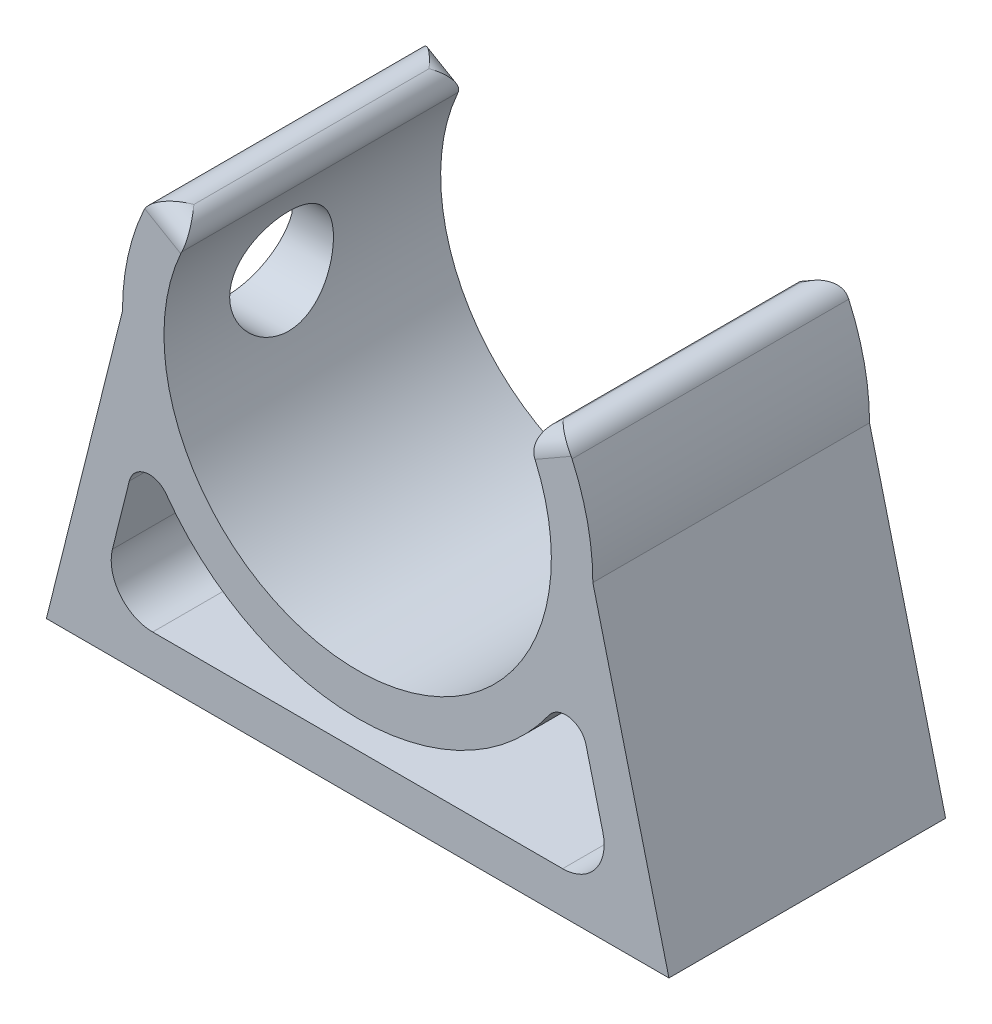
ISO-10303-21;
HEADER;
FILE_DESCRIPTION(('STEP AP214'),'2;1');
FILE_NAME('part.step','',(''),(''),'','','');
FILE_SCHEMA(('AUTOMOTIVE_DESIGN { 1 0 10303 214 1 1 1 1 }'));
ENDSEC;
DATA;
#1=APPLICATION_CONTEXT('core data for automotive mechanical design processes');
#2=APPLICATION_PROTOCOL_DEFINITION('international standard','automotive_design',2000,#1);
#3=PRODUCT_CONTEXT('',#1,'mechanical');
#4=PRODUCT('Part','Part','',(#3));
#5=PRODUCT_RELATED_PRODUCT_CATEGORY('part','',(#4));
#6=PRODUCT_DEFINITION_FORMATION('','',#4);
#7=PRODUCT_DEFINITION_CONTEXT('part definition',#1,'design');
#8=PRODUCT_DEFINITION('design','',#6,#7);
#9=PRODUCT_DEFINITION_SHAPE('','',#8);
#10=(LENGTH_UNIT() NAMED_UNIT(*) SI_UNIT(.MILLI.,.METRE.));
#11=(NAMED_UNIT(*) PLANE_ANGLE_UNIT() SI_UNIT($,.RADIAN.));
#12=(NAMED_UNIT(*) SI_UNIT($,.STERADIAN.) SOLID_ANGLE_UNIT());
#13=UNCERTAINTY_MEASURE_WITH_UNIT(LENGTH_MEASURE(1.E-05),#10,'distance_accuracy_value','');
#14=(GEOMETRIC_REPRESENTATION_CONTEXT(3) GLOBAL_UNCERTAINTY_ASSIGNED_CONTEXT((#13)) GLOBAL_UNIT_ASSIGNED_CONTEXT((#10,
#11,#12)) REPRESENTATION_CONTEXT('',''));
#15=CARTESIAN_POINT('',(0.,0.,0.));
#16=DIRECTION('',(0.,0.,1.));
#17=DIRECTION('',(1.,0.,0.));
#18=AXIS2_PLACEMENT_3D('',#15,#16,#17);
#19=CARTESIAN_POINT('',(0.,0.,20.));
#20=DIRECTION('',(0.,0.,-1.));
#21=DIRECTION('',(-1.,0.,0.));
#22=AXIS2_PLACEMENT_3D('',#19,#20,#21);
#23=CYLINDRICAL_SURFACE('',#22,17.);
#24=CARTESIAN_POINT('',(0.,0.,0.));
#25=DIRECTION('',(0.,0.,1.));
#26=DIRECTION('',(-1.,0.,0.));
#27=AXIS2_PLACEMENT_3D('',#24,#25,#26);
#28=CIRCLE('',#27,17.);
#29=CARTESIAN_POINT('',(-13.8305170650773,-9.8851807121876,0.));
#30=VERTEX_POINT('',#29);
#31=CARTESIAN_POINT('',(13.8305170650773,-9.8851807121876,0.));
#32=VERTEX_POINT('',#31);
#33=EDGE_CURVE('E273',#30,#32,#28,.T.);
#34=ORIENTED_EDGE('',*,*,#33,.T.);
#35=DIRECTION('',(0.,0.,-1.));
#36=VECTOR('',#35,1.);
#37=CARTESIAN_POINT('',(13.8305170650773,-9.8851807121876,20.));
#38=LINE('',#37,#36);
#39=CARTESIAN_POINT('',(13.8305170650773,-9.8851807121876,20.));
#40=VERTEX_POINT('',#39);
#41=EDGE_CURVE('E276',#32,#40,#38,.F.);
#42=ORIENTED_EDGE('',*,*,#41,.T.);
#43=CARTESIAN_POINT('',(0.,0.,20.));
#44=DIRECTION('',(0.,0.,1.));
#45=DIRECTION('',(-1.,0.,0.));
#46=AXIS2_PLACEMENT_3D('',#43,#44,#45);
#47=CIRCLE('',#46,17.);
#48=CARTESIAN_POINT('',(-13.8305170650773,-9.8851807121876,20.));
#49=VERTEX_POINT('',#48);
#50=EDGE_CURVE('E268',#49,#40,#47,.T.);
#51=ORIENTED_EDGE('',*,*,#50,.F.);
#52=DIRECTION('',(0.,0.,-1.));
#53=VECTOR('',#52,1.);
#54=CARTESIAN_POINT('',(-13.8305170650773,-9.8851807121876,20.));
#55=LINE('',#54,#53);
#56=EDGE_CURVE('E267',#49,#30,#55,.T.);
#57=ORIENTED_EDGE('',*,*,#56,.T.);
#58=EDGE_LOOP('',(#34,#42,#51,#57));
#59=FACE_BOUND('',#58,.T.);
#60=ADVANCED_FACE('F33',(#59),#23,.T.);
#61=CARTESIAN_POINT('',(17.,0.,0.));
#62=VERTEX_POINT('',#61);
#63=CARTESIAN_POINT('',(15.4959628502761,6.99107540674996,0.));
#64=VERTEX_POINT('',#63);
#65=EDGE_CURVE('E270',#62,#64,#28,.T.);
#66=ORIENTED_EDGE('',*,*,#65,.T.);
#67=DIRECTION('',(0.,0.,-1.));
#68=VECTOR('',#67,1.);
#69=CARTESIAN_POINT('',(15.4959628502761,6.99107540674996,20.));
#70=LINE('',#69,#68);
#71=CARTESIAN_POINT('',(15.4959628502761,6.99107540674996,20.));
#72=VERTEX_POINT('',#71);
#73=EDGE_CURVE('E303',#64,#72,#70,.F.);
#74=ORIENTED_EDGE('',*,*,#73,.T.);
#75=CARTESIAN_POINT('',(17.,0.,20.));
#76=VERTEX_POINT('',#75);
#77=EDGE_CURVE('E263',#76,#72,#47,.T.);
#78=ORIENTED_EDGE('',*,*,#77,.F.);
#79=DIRECTION('',(0.,0.,1.));
#80=VECTOR('',#79,1.);
#81=CARTESIAN_POINT('',(17.,0.,0.));
#82=LINE('',#81,#80);
#83=EDGE_CURVE('E370',#62,#76,#82,.T.);
#84=ORIENTED_EDGE('',*,*,#83,.F.);
#85=EDGE_LOOP('',(#66,#74,#78,#84));
#86=FACE_BOUND('',#85,.T.);
#87=ADVANCED_FACE('F185',(#86),#23,.T.);
#88=CARTESIAN_POINT('',(0.,0.,20.));
#89=DIRECTION('',(0.,0.,-1.));
#90=DIRECTION('',(-1.,0.,0.));
#91=AXIS2_PLACEMENT_3D('',#88,#89,#90);
#92=CYLINDRICAL_SURFACE('',#91,14.);
#93=CARTESIAN_POINT('',(-14.,0.,7.75));
#94=CARTESIAN_POINT('',(-13.9999969181573,-0.206693194396538,7.75000483505898));
#95=CARTESIAN_POINT('',(-13.9953776319337,-0.41343806367435,7.76714610220254));
#96=CARTESIAN_POINT('',(-13.9773990829539,-0.820969862791221,7.83513552614482));
#97=CARTESIAN_POINT('',(-13.9640356690741,-1.02175391548544,7.88599969245871));
#98=CARTESIAN_POINT('',(-13.9300434724718,-1.41142278237324,8.01966092872794));
#99=CARTESIAN_POINT('',(-13.9094241068169,-1.60032264754359,8.10241662174746));
#100=CARTESIAN_POINT('',(-13.8630978754628,-1.96156207160297,8.29735783286409));
#101=CARTESIAN_POINT('',(-13.8373906587195,-2.13390048659014,8.40954538183062));
#102=CARTESIAN_POINT('',(-13.782991165185,-2.46115350401006,8.6629342879335));
#103=CARTESIAN_POINT('',(-13.7542475093215,-2.61562582067076,8.80469583911751));
#104=CARTESIAN_POINT('',(-13.6973438235512,-2.89891253828471,9.11201126260903));
#105=CARTESIAN_POINT('',(-13.6691838699185,-3.02772360470914,9.27756822218466));
#106=CARTESIAN_POINT('',(-13.6161097987105,-3.25819360344407,9.63131242429841));
#107=CARTESIAN_POINT('',(-13.5912604727327,-3.35934267447455,9.81984246412669));
#108=CARTESIAN_POINT('',(-13.5483770289426,-3.52833300981394,10.2120059770412));
#109=CARTESIAN_POINT('',(-13.5303416421074,-3.59618047689324,10.4156366293415));
#110=CARTESIAN_POINT('',(-13.5036587355314,-3.69510361973294,10.8273203694862));
#111=CARTESIAN_POINT('',(-13.4948067427114,-3.72698165668634,11.035167082036));
#112=CARTESIAN_POINT('',(-13.4868820581204,-3.75556265978959,11.4534323328805));
#113=CARTESIAN_POINT('',(-13.4878075213694,-3.75227226212824,11.6638503784867));
#114=CARTESIAN_POINT('',(-13.4991502358043,-3.71124656168664,12.0750139866044));
#115=CARTESIAN_POINT('',(-13.5092996190115,-3.67448327552769,12.275865103001));
#116=CARTESIAN_POINT('',(-13.5375175364438,-3.56911264393678,12.6684389259922));
#117=CARTESIAN_POINT('',(-13.5555867086275,-3.50050273315364,12.8601608958319));
#118=CARTESIAN_POINT('',(-13.5978430586519,-3.33259699631664,13.2315625019532));
#119=CARTESIAN_POINT('',(-13.6220974353,-3.23296127882527,13.4110805092446));
#120=CARTESIAN_POINT('',(-13.6739553442923,-3.00606930702864,13.7511901878202));
#121=CARTESIAN_POINT('',(-13.7015595407456,-2.87880757184767,13.9117780936895));
#122=CARTESIAN_POINT('',(-13.7581208292968,-2.59531088531363,14.2150212704481));
#123=CARTESIAN_POINT('',(-13.7870925421535,-2.43826000075807,14.3569120939003));
#124=CARTESIAN_POINT('',(-13.8423098512509,-2.10223814217429,14.6124996538405));
#125=CARTESIAN_POINT('',(-13.8685553381172,-1.92326628931813,14.7261952594082));
#126=CARTESIAN_POINT('',(-13.9155268808949,-1.54729209854974,14.9225057589209));
#127=CARTESIAN_POINT('',(-13.9362280653855,-1.35021366877527,15.0049812624836));
#128=CARTESIAN_POINT('',(-13.9695988033294,-0.944307372545186,15.1354090070606));
#129=CARTESIAN_POINT('',(-13.9822701279755,-0.735482108229239,15.1833688617088));
#130=CARTESIAN_POINT('',(-13.9978851570628,-0.318533005881959,15.2422011819891));
#131=CARTESIAN_POINT('',(-14.001101357758,-0.110565786264655,15.2541128603254));
#132=CARTESIAN_POINT('',(-13.9982277444432,0.30439516778239,15.2433820661643));
#133=CARTESIAN_POINT('',(-13.992138901558,0.511389001538495,15.2207431995496));
#134=CARTESIAN_POINT('',(-13.9715154451844,0.91481107142473,15.14240597474));
#135=CARTESIAN_POINT('',(-13.9571292436082,1.11136032841757,15.0872881891234));
#136=CARTESIAN_POINT('',(-13.9215439046482,1.49240300684834,14.946232728366));
#137=CARTESIAN_POINT('',(-13.9003440256541,1.67689511333757,14.8602916982619));
#138=CARTESIAN_POINT('',(-13.8528455536341,2.0326172133608,14.6581079816797));
#139=CARTESIAN_POINT('',(-13.8264546612798,2.20351394814835,14.5413011869556));
#140=CARTESIAN_POINT('',(-13.7716243596428,2.52364528110298,14.2814100052443));
#141=CARTESIAN_POINT('',(-13.7431845426651,2.67287555016588,14.138320379674));
#142=CARTESIAN_POINT('',(-13.6864576330414,2.94982380121893,13.8250742091651));
#143=CARTESIAN_POINT('',(-13.6581979435779,3.07680831212489,13.6542630118087));
#144=CARTESIAN_POINT('',(-13.6059200310189,3.30032827755811,13.2931575278938));
#145=CARTESIAN_POINT('',(-13.5819016322732,3.39686499319045,13.1028640486966));
#146=CARTESIAN_POINT('',(-13.5411024177664,3.55602296846394,12.70913714001));
#147=CARTESIAN_POINT('',(-13.5242799757809,3.61883984037042,12.5057873309058));
#148=CARTESIAN_POINT('',(-13.4997714661649,3.70923246011172,12.09088307085));
#149=CARTESIAN_POINT('',(-13.4920830382258,3.7368173123455,11.8793307540952));
#150=CARTESIAN_POINT('',(-13.4869114709755,3.75543576403755,11.4615395084116));
#151=CARTESIAN_POINT('',(-13.4890990198281,3.74764877392543,11.2553564316764));
#152=CARTESIAN_POINT('',(-13.5026612072291,3.69848309743951,10.8473586891929));
#153=CARTESIAN_POINT('',(-13.514035605338,3.65710529020927,10.645543909259));
#154=CARTESIAN_POINT('',(-13.544492981477,3.54261911979473,10.2535108781051));
#155=CARTESIAN_POINT('',(-13.5635146511487,3.46976278165109,10.0632139288892));
#156=CARTESIAN_POINT('',(-13.6071243123648,3.29458333161021,9.69740006985732));
#157=CARTESIAN_POINT('',(-13.6317131840505,3.19225555975918,9.52188550307352));
#158=CARTESIAN_POINT('',(-13.6845979845993,2.95747241239947,9.18499420664048));
#159=CARTESIAN_POINT('',(-13.7129822568129,2.82421322273553,9.0241914620269));
#160=CARTESIAN_POINT('',(-13.7697686255632,2.53287590458478,8.72684710865586));
#161=CARTESIAN_POINT('',(-13.7981707247576,2.37479173799474,8.59031141956876));
#162=CARTESIAN_POINT('',(-13.8525276947612,2.03416379099758,8.34247082768535));
#163=CARTESIAN_POINT('',(-13.8784162993454,1.85116469636623,8.23177592337126));
#164=CARTESIAN_POINT('',(-13.924102357272,1.46846728935059,8.04289556822169));
#165=CARTESIAN_POINT('',(-13.9439036822881,1.26877969453556,7.96468944247902));
#166=CARTESIAN_POINT('',(-13.9726511296174,0.891554125959533,7.85310112091499));
#167=CARTESIAN_POINT('',(-13.9828318901817,0.71562824369555,7.81452848528266));
#168=CARTESIAN_POINT('',(-13.9965073301996,0.359814359754633,7.76297710864784));
#169=CARTESIAN_POINT('',(-14.000002682749,0.179926758793654,7.74999579107336));
#170=CARTESIAN_POINT('',(-14.,0.,7.75));
#171=B_SPLINE_CURVE_WITH_KNOTS('',3,(#93,#94,#95,#96,#97,#98,#99,#100,#101,#102,#103,#104,#105,
#106,#107,#108,#109,#110,#111,#112,#113,#114,#115,#116,#117,#118,#119,#120,#121,#122,#123,#124,
#125,#126,#127,#128,#129,#130,#131,#132,#133,#134,#135,#136,#137,#138,#139,#140,#141,#142,#143,
#144,#145,#146,#147,#148,#149,#150,#151,#152,#153,#154,#155,#156,#157,#158,#159,#160,#161,#162,
#163,#164,#165,#166,#167,#168,#169,#170),.UNSPECIFIED.,.T.,.F.,(4,2,2,2,2,2,2,2,2,2,2,2,2,2,2,2,
2,2,2,2,2,2,2,2,2,2,2,2,2,2,2,2,2,2,2,2,2,2,4),(0.,0.61941970947995,1.23913369130966,
1.85804633166269,2.47700168972635,3.1089647584309,3.74100989353757,4.384020946257,
5.02691218598184,5.65516012383691,6.28328951509308,6.89374096085661,7.50424158904376,
8.12168072220162,8.73924246459899,9.37713589375415,10.0150549049075,10.6557893912375,
11.2963824978025,11.9183234633239,12.5401995241399,13.1512828089618,13.7624326274844,
14.3856338706224,15.0089594626613,15.6500323605001,16.2910787025084,16.928364939953,
17.5654864612422,18.1815231828166,18.7975437819114,19.4087211927312,20.0199952945903,
20.6494061074988,21.2789702478678,21.9221594910346,22.5649387980749,23.1041989496161,
23.6434048048694),.UNSPECIFIED.);
#172=CARTESIAN_POINT('',(-14.,0.,7.75));
#173=VERTEX_POINT('',#172);
#174=EDGE_CURVE('E106',#173,#173,#171,.T.);
#175=ORIENTED_EDGE('',*,*,#174,.T.);
#176=EDGE_LOOP('',(#175));
#177=FACE_BOUND('',#176,.T.);
#178=CARTESIAN_POINT('',(0.,0.,20.));
#179=DIRECTION('',(0.,0.,-1.));
#180=DIRECTION('',(-1.,0.,0.));
#181=AXIS2_PLACEMENT_3D('',#178,#179,#180);
#182=CIRCLE('',#181,14.);
#183=CARTESIAN_POINT('',(12.8206959920768,5.62403363065561,20.));
#184=VERTEX_POINT('',#183);
#185=CARTESIAN_POINT('',(-12.7883262338761,5.69725478945389,20.));
#186=VERTEX_POINT('',#185);
#187=EDGE_CURVE('E260',#184,#186,#182,.T.);
#188=ORIENTED_EDGE('',*,*,#187,.F.);
#189=CARTESIAN_POINT('',(12.8206959920768,5.62403363065561,20.));
#190=CARTESIAN_POINT('',(12.810902978588,5.64635730694196,19.9999999646795));
#191=CARTESIAN_POINT('',(12.8010635700718,5.6686293606408,19.9994132423461));
#192=CARTESIAN_POINT('',(12.7812919629847,5.71307022286343,19.9970664236539));
#193=CARTESIAN_POINT('',(12.7713597644138,5.73523903138722,19.995306327295));
#194=CARTESIAN_POINT('',(12.7613811708156,5.75735621732349,19.9929595439234));
#195=B_SPLINE_CURVE_WITH_KNOTS('',3,(#189,#190,#191,#192,#193,#194),.UNSPECIFIED.,.F.,.F.,(4,2,
4),(0.,0.0730672512900171,0.146134502580035),.UNSPECIFIED.);
#196=CARTESIAN_POINT('',(12.7613811708156,5.7573562173235,19.9929595439234));
#197=VERTEX_POINT('',#196);
#198=EDGE_CURVE('E56',#184,#197,#195,.T.);
#199=ORIENTED_EDGE('',*,*,#198,.T.);
#200=DIRECTION('',(0.,0.,-1.));
#201=VECTOR('',#200,1.);
#202=CARTESIAN_POINT('',(12.7613811708156,5.7573562173235,20.));
#203=LINE('',#202,#201);
#204=CARTESIAN_POINT('',(12.7613811708156,5.7573562173235,0.00704045607662768));
#205=VERTEX_POINT('',#204);
#206=EDGE_CURVE('E203',#197,#205,#203,.T.);
#207=ORIENTED_EDGE('',*,*,#206,.T.);
#208=CARTESIAN_POINT('',(12.7613811708156,5.7573562173235,0.00704045607662768));
#209=CARTESIAN_POINT('',(12.7713597644138,5.73523903138722,0.00469367270495456));
#210=CARTESIAN_POINT('',(12.7812919629847,5.71307022286343,0.0029335763460658));
#211=CARTESIAN_POINT('',(12.8010635700718,5.6686293606408,0.000586757653857002));
#212=CARTESIAN_POINT('',(12.810902978588,5.64635730694196,3.53205369712999E-08));
#213=CARTESIAN_POINT('',(12.8206959920768,5.62403363065561,0.));
#214=B_SPLINE_CURVE_WITH_KNOTS('',3,(#208,#209,#210,#211,#212,#213),.UNSPECIFIED.,.F.,.F.,(4,2,
4),(0.,0.0730672512900183,0.146134502580038),.UNSPECIFIED.);
#215=CARTESIAN_POINT('',(12.8206959920768,5.62403363065561,0.));
#216=VERTEX_POINT('',#215);
#217=EDGE_CURVE('E160',#205,#216,#214,.T.);
#218=ORIENTED_EDGE('',*,*,#217,.T.);
#219=CARTESIAN_POINT('',(0.,0.,0.));
#220=DIRECTION('',(0.,0.,-1.));
#221=DIRECTION('',(-1.,0.,0.));
#222=AXIS2_PLACEMENT_3D('',#219,#220,#221);
#223=CIRCLE('',#222,14.);
#224=CARTESIAN_POINT('',(-12.7883262338761,5.69725478945389,0.));
#225=VERTEX_POINT('',#224);
#226=EDGE_CURVE('E156',#216,#225,#223,.T.);
#227=ORIENTED_EDGE('',*,*,#226,.T.);
#228=CARTESIAN_POINT('',(-12.7883262338761,5.69725478945389,0.));
#229=CARTESIAN_POINT('',(-12.7784057261093,5.71952210096155,3.53205361094281E-08));
#230=CARTESIAN_POINT('',(-12.7684391192693,5.74173752542313,0.000586757653856583));
#231=CARTESIAN_POINT('',(-12.7484137074427,5.78606460025412,0.00293357634606626));
#232=CARTESIAN_POINT('',(-12.7383549024561,5.80817625062353,0.00469367270495545));
#233=CARTESIAN_POINT('',(-12.7282499983964,5.83023601394685,0.007040456076629));
#234=B_SPLINE_CURVE_WITH_KNOTS('',3,(#228,#229,#230,#231,#232,#233),.UNSPECIFIED.,.F.,.F.,(4,2,
4),(0.,0.073067251290018,0.146134502580036),.UNSPECIFIED.);
#235=CARTESIAN_POINT('',(-12.7282499983964,5.83023601394685,0.00704045607662768));
#236=VERTEX_POINT('',#235);
#237=EDGE_CURVE('E151',#225,#236,#234,.T.);
#238=ORIENTED_EDGE('',*,*,#237,.T.);
#239=DIRECTION('',(0.,0.,-1.));
#240=VECTOR('',#239,1.);
#241=CARTESIAN_POINT('',(-12.7282499983964,5.83023601394685,20.));
#242=LINE('',#241,#240);
#243=CARTESIAN_POINT('',(-12.7282499983964,5.83023601394685,19.9929595439234));
#244=VERTEX_POINT('',#243);
#245=EDGE_CURVE('E153',#236,#244,#242,.F.);
#246=ORIENTED_EDGE('',*,*,#245,.T.);
#247=CARTESIAN_POINT('',(-12.7282499983964,5.83023601394685,19.9929595439234));
#248=CARTESIAN_POINT('',(-12.7383549024561,5.80817625062353,19.995306327295));
#249=CARTESIAN_POINT('',(-12.7484137074427,5.78606460025412,19.9970664236539));
#250=CARTESIAN_POINT('',(-12.7684391192693,5.74173752542313,19.9994132423461));
#251=CARTESIAN_POINT('',(-12.7784057261093,5.71952210096155,19.9999999646795));
#252=CARTESIAN_POINT('',(-12.7883262338761,5.69725478945389,20.));
#253=B_SPLINE_CURVE_WITH_KNOTS('',3,(#247,#248,#249,#250,#251,#252),.UNSPECIFIED.,.F.,.F.,(4,2,
4),(0.,0.0730672512900184,0.146134502580037),.UNSPECIFIED.);
#254=EDGE_CURVE('E97',#244,#186,#253,.T.);
#255=ORIENTED_EDGE('',*,*,#254,.T.);
#256=EDGE_LOOP('',(#188,#199,#207,#218,#227,#238,#246,#255));
#257=FACE_BOUND('',#256,.T.);
#258=ADVANCED_FACE('F152',(#177,#257),#92,.F.);
#259=DIRECTION('',(0.,0.,1.));
#260=VECTOR('',#259,1.);
#261=CARTESIAN_POINT('',(-17.,-1.18710365520667E-13,0.));
#262=LINE('',#261,#260);
#263=CARTESIAN_POINT('',(-17.,0.,0.));
#264=VERTEX_POINT('',#263);
#265=CARTESIAN_POINT('',(-17.,-1.18710365520667E-13,7.75));
#266=VERTEX_POINT('',#265);
#267=EDGE_CURVE('E242',#264,#266,#262,.T.);
#268=ORIENTED_EDGE('',*,*,#267,.T.);
#269=CARTESIAN_POINT('',(-17.,-1.20792265079217E-13,7.75));
#270=CARTESIAN_POINT('',(-17.0000091460502,0.104131685390415,7.74998848106547));
#271=CARTESIAN_POINT('',(-16.9990434314155,0.208256956675918,7.75433722089685));
#272=CARTESIAN_POINT('',(-16.9952300493571,0.415738665461369,7.77166589192266));
#273=CARTESIAN_POINT('',(-16.9923826321623,0.519095203339767,7.78464467549441));
#274=CARTESIAN_POINT('',(-16.9848797730639,0.724142273973255,7.81911569877296));
#275=CARTESIAN_POINT('',(-16.9802273212015,0.825835273554893,7.84059386042227));
#276=CARTESIAN_POINT('',(-16.9692509372055,1.02698041681211,7.89187051753148));
#277=CARTESIAN_POINT('',(-16.9629269952873,1.12643254736607,7.92166906169843));
#278=CARTESIAN_POINT('',(-16.9416910824803,1.42039757827677,8.02324090418576));
#279=CARTESIAN_POINT('',(-16.9245083181617,1.61069082536354,8.10721951596584));
#280=CARTESIAN_POINT('',(-16.885949582621,1.97440841715845,8.30513572707203));
#281=CARTESIAN_POINT('',(-16.86457300153,2.14783030292311,8.419077684519));
#282=CARTESIAN_POINT('',(-16.8195788818415,2.47579573598715,8.67566276386042));
#283=CARTESIAN_POINT('',(-16.795933365232,2.63002940163024,8.81869776039047));
#284=CARTESIAN_POINT('',(-16.7492609914701,2.9125273723824,9.1285738268746));
#285=CARTESIAN_POINT('',(-16.7262342420238,3.04078718140534,9.29541900987623));
#286=CARTESIAN_POINT('',(-16.6831303905539,3.26907474492663,9.65049074090263));
#287=CARTESIAN_POINT('',(-16.6630893725462,3.36876878012747,9.83893664258224));
#288=CARTESIAN_POINT('',(-16.6286321042371,3.53494624809196,10.2304117551183));
#289=CARTESIAN_POINT('',(-16.6142148671818,3.60143550757089,10.4334384002147));
#290=CARTESIAN_POINT('',(-16.5929231532483,3.69828944226396,10.8449266133428));
#291=CARTESIAN_POINT('',(-16.5859331148426,3.72920821569115,11.0532516510417));
#292=CARTESIAN_POINT('',(-16.5799402088168,3.7557665121282,11.4722451076029));
#293=CARTESIAN_POINT('',(-16.5809365262222,3.75140963487088,11.6829132851668));
#294=CARTESIAN_POINT('',(-16.5906994592594,3.70798492342588,12.0964759290784));
#295=CARTESIAN_POINT('',(-16.5993215649783,3.66956260197186,12.2994421061687));
#296=CARTESIAN_POINT('',(-16.6231359474766,3.56012044108413,12.6959734138657));
#297=CARTESIAN_POINT('',(-16.6383285463489,3.48909900359535,12.8895380830826));
#298=CARTESIAN_POINT('',(-16.6737140743166,3.31588566460805,13.2635852207728));
#299=CARTESIAN_POINT('',(-16.693946516966,3.21344589366411,13.4439489974919));
#300=CARTESIAN_POINT('',(-16.737107681786,2.98047170236469,13.7851625893454));
#301=CARTESIAN_POINT('',(-16.7600366995691,2.84993420048641,13.9460102610895));
#302=CARTESIAN_POINT('',(-16.8066225733525,2.5611095509502,14.2473149648552));
#303=CARTESIAN_POINT('',(-16.8302843734181,2.40227740432269,14.3872484361573));
#304=CARTESIAN_POINT('',(-16.8752268686937,2.06297867362147,14.6386530005142));
#305=CARTESIAN_POINT('',(-16.8965069332666,1.88250638573901,14.7501165652632));
#306=CARTESIAN_POINT('',(-16.9248743184229,1.59929535658407,14.8935310096203));
#307=CARTESIAN_POINT('',(-16.9337515885221,1.50261038199756,14.937433565428));
#308=CARTESIAN_POINT('',(-16.9500643627505,1.30577288976387,15.0169163980383));
#309=CARTESIAN_POINT('',(-16.957500433768,1.20562175385793,15.0524999482203));
#310=CARTESIAN_POINT('',(-16.9707096335168,1.00267208973042,15.115026703286));
#311=CARTESIAN_POINT('',(-16.9764844621167,0.899876385788216,15.1419787435981));
#312=CARTESIAN_POINT('',(-16.9862141054492,0.692325239315176,15.1870658047102));
#313=CARTESIAN_POINT('',(-16.9901697760932,0.587570742587094,15.205204972183));
#314=CARTESIAN_POINT('',(-16.9954287585439,0.402245940147039,15.229236278452));
#315=CARTESIAN_POINT('',(-16.997141433234,0.321927745625872,15.2370259107577));
#316=CARTESIAN_POINT('',(-16.9994276271719,0.161075413818267,15.2474051261275));
#317=CARTESIAN_POINT('',(-17.0000030525299,0.0805418647901836,15.2500034103378));
#318=CARTESIAN_POINT('',(-17.,-1.18925715430439E-13,15.25));
#319=B_SPLINE_CURVE_WITH_KNOTS('',3,(#269,#270,#271,#272,#273,#274,#275,#276,#277,#278,#279,
#280,#281,#282,#283,#284,#285,#286,#287,#288,#289,#290,#291,#292,#293,#294,#295,#296,#297,#298,
#299,#300,#301,#302,#303,#304,#305,#306,#307,#308,#309,#310,#311,#312,#313,#314,#315,#316,#317,
#318),.UNSPECIFIED.,.F.,.F.,(4,2,2,2,2,2,2,2,2,2,2,2,2,2,2,2,2,2,2,2,2,2,2,2,4),(0.,
0.312288635984211,0.624535752147588,0.936267824054791,1.2480017208625,1.87095323679521,
2.49399541019572,3.12606345392833,3.75824081557386,4.39752764934577,5.03670226274271,
5.66577926683934,6.29479207706428,6.91213444010459,7.52950706937927,8.15188141239304,
8.77432404699979,9.41039503433478,10.0466340443856,10.3659809822331,10.6852020505012,
11.0040953038915,11.3228383645179,11.5648097442878,11.8063752178332),.UNSPECIFIED.);
#320=CARTESIAN_POINT('',(-17.,-1.18710365520667E-13,15.25));
#321=VERTEX_POINT('',#320);
#322=EDGE_CURVE('E47',#266,#321,#319,.T.);
#323=ORIENTED_EDGE('',*,*,#322,.T.);
#324=CARTESIAN_POINT('',(-17.,0.,20.));
#325=VERTEX_POINT('',#324);
#326=EDGE_CURVE('E252',#321,#325,#262,.T.);
#327=ORIENTED_EDGE('',*,*,#326,.T.);
#328=CARTESIAN_POINT('',(-15.4557321409099,7.07957230264975,20.));
#329=VERTEX_POINT('',#328);
#330=EDGE_CURVE('E264',#329,#325,#47,.T.);
#331=ORIENTED_EDGE('',*,*,#330,.F.);
#332=DIRECTION('',(0.,0.,-1.));
#333=VECTOR('',#332,1.);
#334=CARTESIAN_POINT('',(-15.4557321409099,7.07957230264975,20.));
#335=LINE('',#334,#333);
#336=CARTESIAN_POINT('',(-15.4557321409099,7.07957230264975,0.));
#337=VERTEX_POINT('',#336);
#338=EDGE_CURVE('E42',#329,#337,#335,.T.);
#339=ORIENTED_EDGE('',*,*,#338,.T.);
#340=EDGE_CURVE('E247',#337,#264,#28,.T.);
#341=ORIENTED_EDGE('',*,*,#340,.T.);
#342=EDGE_LOOP('',(#268,#323,#327,#331,#339,#341));
#343=FACE_BOUND('',#342,.T.);
#344=ADVANCED_FACE('F184',(#343),#23,.T.);
#345=CARTESIAN_POINT('',(0.,0.,20.));
#346=DIRECTION('',(0.,0.,-1.));
#347=DIRECTION('',(-1.,0.,0.));
#348=AXIS2_PLACEMENT_3D('',#345,#346,#347);
#349=PLANE('',#348);
#350=ORIENTED_EDGE('',*,*,#77,.T.);
#351=CARTESIAN_POINT('',(14.1286720105458,6.37421581203673,20.));
#352=DIRECTION('',(0.,0.,-1.));
#353=DIRECTION('',(-1.,0.,0.));
#354=AXIS2_PLACEMENT_3D('',#351,#352,#353);
#355=CIRCLE('',#354,1.5);
#356=CARTESIAN_POINT('',(15.4298491930644,7.12049855985627,20.));
#357=VERTEX_POINT('',#356);
#358=EDGE_CURVE('E157',#72,#357,#355,.F.);
#359=ORIENTED_EDGE('',*,*,#358,.T.);
#360=DIRECTION('',(-0.867451455012368,-0.497521831879693,0.));
#361=VECTOR('',#360,1.);
#362=CARTESIAN_POINT('',(0.746282747819536,-1.30117718251855,20.));
#363=LINE('',#362,#361);
#364=EDGE_CURVE('E309',#357,#184,#363,.T.);
#365=ORIENTED_EDGE('',*,*,#364,.T.);
#366=ORIENTED_EDGE('',*,*,#187,.T.);
#367=DIRECTION('',(-0.864592272851371,0.502474080650634,0.));
#368=VECTOR('',#367,1.);
#369=CARTESIAN_POINT('',(-0.753711120975951,-1.29688840927706,20.));
#370=LINE('',#369,#368);
#371=CARTESIAN_POINT('',(-15.3888794789302,7.20861527927426,20.));
#372=VERTEX_POINT('',#371);
#373=EDGE_CURVE('E307',#186,#372,#370,.T.);
#374=ORIENTED_EDGE('',*,*,#373,.T.);
#375=CARTESIAN_POINT('',(-14.0919910696531,6.4549041582983,20.));
#376=DIRECTION('',(0.,0.,-1.));
#377=DIRECTION('',(-1.,0.,0.));
#378=AXIS2_PLACEMENT_3D('',#375,#376,#377);
#379=CIRCLE('',#378,1.5);
#380=EDGE_CURVE('E88',#372,#329,#379,.F.);
#381=ORIENTED_EDGE('',*,*,#380,.T.);
#382=ORIENTED_EDGE('',*,*,#330,.T.);
#383=DIRECTION('',(-0.242535625036334,-0.970142500145332,0.));
#384=VECTOR('',#383,1.);
#385=CARTESIAN_POINT('',(-17.,-1.18710365520667E-13,20.));
#386=LINE('',#385,#384);
#387=CARTESIAN_POINT('',(-22.5,-22.,20.));
#388=VERTEX_POINT('',#387);
#389=EDGE_CURVE('E329',#325,#388,#386,.T.);
#390=ORIENTED_EDGE('',*,*,#389,.T.);
#391=DIRECTION('',(1.,0.,0.));
#392=VECTOR('',#391,1.);
#393=CARTESIAN_POINT('',(-22.5,-22.,20.));
#394=LINE('',#393,#392);
#395=CARTESIAN_POINT('',(22.5,-22.,20.));
#396=VERTEX_POINT('',#395);
#397=EDGE_CURVE('E333',#388,#396,#394,.T.);
#398=ORIENTED_EDGE('',*,*,#397,.T.);
#399=DIRECTION('',(-0.242535625036333,0.970142500145332,0.));
#400=VECTOR('',#399,1.);
#401=CARTESIAN_POINT('',(22.5,-22.,20.));
#402=LINE('',#401,#400);
#403=EDGE_CURVE('E337',#396,#76,#402,.T.);
#404=ORIENTED_EDGE('',*,*,#403,.T.);
#405=EDGE_LOOP('',(#350,#359,#365,#366,#374,#381,#382,#390,#398,#404));
#406=FACE_BOUND('',#405,.T.);
#407=DIRECTION('',(0.242535625036334,0.970142500145332,0.));
#408=VECTOR('',#407,1.);
#409=CARTESIAN_POINT('',(-17.7257690620095,-15.272393124891,20.));
#410=LINE('',#409,#408);
#411=CARTESIAN_POINT('',(-17.7257690620095,-15.272393124891,20.));
#412=VERTEX_POINT('',#411);
#413=CARTESIAN_POINT('',(-16.5060705563315,-10.3935991021791,20.));
#414=VERTEX_POINT('',#413);
#415=EDGE_CURVE('E355',#412,#414,#410,.T.);
#416=ORIENTED_EDGE('',*,*,#415,.T.);
#417=CARTESIAN_POINT('',(-15.0508568061135,-10.7574025397336,20.));
#418=DIRECTION('',(0.,0.,-1.));
#419=DIRECTION('',(-1.,0.,0.));
#420=AXIS2_PLACEMENT_3D('',#417,#418,#419);
#421=CIRCLE('',#420,1.5);
#422=EDGE_CURVE('E291',#414,#49,#421,.T.);
#423=ORIENTED_EDGE('',*,*,#422,.T.);
#424=ORIENTED_EDGE('',*,*,#50,.T.);
#425=CARTESIAN_POINT('',(15.0508568061135,-10.7574025397336,20.));
#426=DIRECTION('',(0.,0.,-1.));
#427=DIRECTION('',(-1.,0.,0.));
#428=AXIS2_PLACEMENT_3D('',#425,#426,#427);
#429=CIRCLE('',#428,1.5);
#430=CARTESIAN_POINT('',(16.5060705563315,-10.3935991021791,20.));
#431=VERTEX_POINT('',#430);
#432=EDGE_CURVE('E285',#40,#431,#429,.T.);
#433=ORIENTED_EDGE('',*,*,#432,.T.);
#434=DIRECTION('',(0.242535625036334,-0.970142500145332,0.));
#435=VECTOR('',#434,1.);
#436=CARTESIAN_POINT('',(17.7257690620095,-15.272393124891,20.));
#437=LINE('',#436,#435);
#438=CARTESIAN_POINT('',(17.7257690620095,-15.272393124891,20.));
#439=VERTEX_POINT('',#438);
#440=EDGE_CURVE('E343',#431,#439,#437,.T.);
#441=ORIENTED_EDGE('',*,*,#440,.T.);
#442=CARTESIAN_POINT('',(14.8153415615735,-16.,20.));
#443=DIRECTION('',(0.,0.,-1.));
#444=DIRECTION('',(1.,0.,0.));
#445=AXIS2_PLACEMENT_3D('',#442,#443,#444);
#446=CIRCLE('',#445,3.);
#447=CARTESIAN_POINT('',(14.8153415615735,-19.,20.));
#448=VERTEX_POINT('',#447);
#449=EDGE_CURVE('E346',#439,#448,#446,.T.);
#450=ORIENTED_EDGE('',*,*,#449,.T.);
#451=DIRECTION('',(-1.,0.,0.));
#452=VECTOR('',#451,1.);
#453=CARTESIAN_POINT('',(-14.8153415615735,-19.,20.));
#454=LINE('',#453,#452);
#455=CARTESIAN_POINT('',(-14.8153415615735,-19.,20.));
#456=VERTEX_POINT('',#455);
#457=EDGE_CURVE('E349',#448,#456,#454,.T.);
#458=ORIENTED_EDGE('',*,*,#457,.T.);
#459=CARTESIAN_POINT('',(-14.8153415615735,-16.,20.));
#460=DIRECTION('',(0.,0.,-1.));
#461=DIRECTION('',(-1.,0.,0.));
#462=AXIS2_PLACEMENT_3D('',#459,#460,#461);
#463=CIRCLE('',#462,3.);
#464=EDGE_CURVE('E352',#456,#412,#463,.T.);
#465=ORIENTED_EDGE('',*,*,#464,.T.);
#466=EDGE_LOOP('',(#416,#423,#424,#433,#441,#450,#458,#465));
#467=FACE_BOUND('',#466,.T.);
#468=ADVANCED_FACE('F230',(#406,#467),#349,.F.);
#469=CARTESIAN_POINT('',(0.,0.,0.));
#470=DIRECTION('',(0.,0.,-1.));
#471=DIRECTION('',(-1.,0.,0.));
#472=AXIS2_PLACEMENT_3D('',#469,#470,#471);
#473=PLANE('',#472);
#474=DIRECTION('',(-0.867451455012368,-0.497521831879693,0.));
#475=VECTOR('',#474,1.);
#476=CARTESIAN_POINT('',(15.4929574830298,7.15669395943623,0.));
#477=LINE('',#476,#475);
#478=CARTESIAN_POINT('',(15.4298491930644,7.12049855985627,0.));
#479=VERTEX_POINT('',#478);
#480=EDGE_CURVE('E299',#216,#479,#477,.F.);
#481=ORIENTED_EDGE('',*,*,#480,.T.);
#482=CARTESIAN_POINT('',(14.1286720105458,6.37421581203673,0.));
#483=DIRECTION('',(0.,0.,-1.));
#484=DIRECTION('',(-1.,0.,0.));
#485=AXIS2_PLACEMENT_3D('',#482,#483,#484);
#486=CIRCLE('',#485,1.5);
#487=EDGE_CURVE('E301',#479,#64,#486,.T.);
#488=ORIENTED_EDGE('',*,*,#487,.T.);
#489=ORIENTED_EDGE('',*,*,#65,.F.);
#490=DIRECTION('',(-0.242535625036333,0.970142500145332,0.));
#491=VECTOR('',#490,1.);
#492=CARTESIAN_POINT('',(22.5,-22.,0.));
#493=LINE('',#492,#491);
#494=CARTESIAN_POINT('',(22.5,-22.,0.));
#495=VERTEX_POINT('',#494);
#496=EDGE_CURVE('E475',#495,#62,#493,.T.);
#497=ORIENTED_EDGE('',*,*,#496,.F.);
#498=DIRECTION('',(1.,0.,0.));
#499=VECTOR('',#498,1.);
#500=CARTESIAN_POINT('',(-22.5,-22.,0.));
#501=LINE('',#500,#499);
#502=CARTESIAN_POINT('',(-22.5,-22.,0.));
#503=VERTEX_POINT('',#502);
#504=EDGE_CURVE('E383',#503,#495,#501,.T.);
#505=ORIENTED_EDGE('',*,*,#504,.F.);
#506=DIRECTION('',(-0.242535625036334,-0.970142500145332,0.));
#507=VECTOR('',#506,1.);
#508=CARTESIAN_POINT('',(-17.,-1.18710365520667E-13,0.));
#509=LINE('',#508,#507);
#510=EDGE_CURVE('E358',#264,#503,#509,.T.);
#511=ORIENTED_EDGE('',*,*,#510,.F.);
#512=ORIENTED_EDGE('',*,*,#340,.F.);
#513=CARTESIAN_POINT('',(-14.0919910696531,6.4549041582983,0.));
#514=DIRECTION('',(0.,0.,-1.));
#515=DIRECTION('',(-1.,0.,0.));
#516=AXIS2_PLACEMENT_3D('',#513,#514,#515);
#517=CIRCLE('',#516,1.5);
#518=CARTESIAN_POINT('',(-15.3888794789302,7.20861527927425,0.));
#519=VERTEX_POINT('',#518);
#520=EDGE_CURVE('E121',#337,#519,#517,.T.);
#521=ORIENTED_EDGE('',*,*,#520,.T.);
#522=DIRECTION('',(-0.864592272851371,0.502474080650634,0.));
#523=VECTOR('',#522,1.);
#524=CARTESIAN_POINT('',(-12.8580029408951,5.73774871983182,0.));
#525=LINE('',#524,#523);
#526=EDGE_CURVE('E117',#519,#225,#525,.F.);
#527=ORIENTED_EDGE('',*,*,#526,.T.);
#528=ORIENTED_EDGE('',*,*,#226,.F.);
#529=EDGE_LOOP('',(#481,#488,#489,#497,#505,#511,#512,#521,#527,#528));
#530=FACE_BOUND('',#529,.T.);
#531=ORIENTED_EDGE('',*,*,#33,.F.);
#532=CARTESIAN_POINT('',(-15.0508568061135,-10.7574025397336,0.));
#533=DIRECTION('',(0.,0.,-1.));
#534=DIRECTION('',(-1.,0.,0.));
#535=AXIS2_PLACEMENT_3D('',#532,#533,#534);
#536=CIRCLE('',#535,1.5);
#537=CARTESIAN_POINT('',(-16.5060705563315,-10.3935991021791,0.));
#538=VERTEX_POINT('',#537);
#539=EDGE_CURVE('E294',#30,#538,#536,.F.);
#540=ORIENTED_EDGE('',*,*,#539,.T.);
#541=DIRECTION('',(0.242535625036334,0.970142500145332,0.));
#542=VECTOR('',#541,1.);
#543=CARTESIAN_POINT('',(-17.7257690620095,-15.272393124891,0.));
#544=LINE('',#543,#542);
#545=CARTESIAN_POINT('',(-17.7257690620095,-15.272393124891,0.));
#546=VERTEX_POINT('',#545);
#547=EDGE_CURVE('E257',#546,#538,#544,.T.);
#548=ORIENTED_EDGE('',*,*,#547,.F.);
#549=CARTESIAN_POINT('',(-14.8153415615735,-16.,0.));
#550=DIRECTION('',(0.,0.,-1.));
#551=DIRECTION('',(-1.,0.,0.));
#552=AXIS2_PLACEMENT_3D('',#549,#550,#551);
#553=CIRCLE('',#552,3.);
#554=CARTESIAN_POINT('',(-14.8153415615735,-19.,0.));
#555=VERTEX_POINT('',#554);
#556=EDGE_CURVE('E485',#555,#546,#553,.T.);
#557=ORIENTED_EDGE('',*,*,#556,.F.);
#558=DIRECTION('',(-1.,0.,0.));
#559=VECTOR('',#558,1.);
#560=CARTESIAN_POINT('',(-14.8153415615735,-19.,0.));
#561=LINE('',#560,#559);
#562=CARTESIAN_POINT('',(14.8153415615735,-19.,0.));
#563=VERTEX_POINT('',#562);
#564=EDGE_CURVE('E483',#563,#555,#561,.T.);
#565=ORIENTED_EDGE('',*,*,#564,.F.);
#566=CARTESIAN_POINT('',(14.8153415615735,-16.,0.));
#567=DIRECTION('',(0.,0.,-1.));
#568=DIRECTION('',(1.,0.,0.));
#569=AXIS2_PLACEMENT_3D('',#566,#567,#568);
#570=CIRCLE('',#569,3.);
#571=CARTESIAN_POINT('',(17.7257690620095,-15.272393124891,0.));
#572=VERTEX_POINT('',#571);
#573=EDGE_CURVE('E481',#572,#563,#570,.T.);
#574=ORIENTED_EDGE('',*,*,#573,.F.);
#575=DIRECTION('',(0.242535625036334,-0.970142500145332,0.));
#576=VECTOR('',#575,1.);
#577=CARTESIAN_POINT('',(17.7257690620095,-15.272393124891,0.));
#578=LINE('',#577,#576);
#579=CARTESIAN_POINT('',(16.5060705563315,-10.3935991021791,0.));
#580=VERTEX_POINT('',#579);
#581=EDGE_CURVE('E445',#580,#572,#578,.T.);
#582=ORIENTED_EDGE('',*,*,#581,.F.);
#583=CARTESIAN_POINT('',(15.0508568061135,-10.7574025397336,0.));
#584=DIRECTION('',(0.,0.,-1.));
#585=DIRECTION('',(-1.,0.,0.));
#586=AXIS2_PLACEMENT_3D('',#583,#584,#585);
#587=CIRCLE('',#586,1.5);
#588=EDGE_CURVE('E288',#580,#32,#587,.F.);
#589=ORIENTED_EDGE('',*,*,#588,.T.);
#590=EDGE_LOOP('',(#531,#540,#548,#557,#565,#574,#582,#589));
#591=FACE_BOUND('',#590,.T.);
#592=ADVANCED_FACE('F236',(#530,#591),#473,.T.);
#593=CARTESIAN_POINT('',(-17.7257690620095,-15.272393124891,0.));
#594=DIRECTION('',(0.970142500145332,-0.242535625036334,0.));
#595=DIRECTION('',(0.242535625036334,0.970142500145332,0.));
#596=AXIS2_PLACEMENT_3D('',#593,#594,#595);
#597=PLANE('',#596);
#598=ORIENTED_EDGE('',*,*,#547,.T.);
#599=DIRECTION('',(0.,0.,-1.));
#600=VECTOR('',#599,1.);
#601=CARTESIAN_POINT('',(-16.5060705563315,-10.3935991021791,0.));
#602=LINE('',#601,#600);
#603=EDGE_CURVE('E282',#538,#414,#602,.F.);
#604=ORIENTED_EDGE('',*,*,#603,.T.);
#605=ORIENTED_EDGE('',*,*,#415,.F.);
#606=DIRECTION('',(0.,0.,1.));
#607=VECTOR('',#606,1.);
#608=CARTESIAN_POINT('',(-17.7257690620095,-15.272393124891,0.));
#609=LINE('',#608,#607);
#610=EDGE_CURVE('E271',#546,#412,#609,.T.);
#611=ORIENTED_EDGE('',*,*,#610,.F.);
#612=EDGE_LOOP('',(#598,#604,#605,#611));
#613=FACE_BOUND('',#612,.T.);
#614=ADVANCED_FACE('F490',(#613),#597,.T.);
#615=CARTESIAN_POINT('',(-14.8153415615735,-16.,0.));
#616=DIRECTION('',(0.,0.,1.));
#617=DIRECTION('',(1.,0.,0.));
#618=AXIS2_PLACEMENT_3D('',#615,#616,#617);
#619=CYLINDRICAL_SURFACE('',#618,3.);
#620=ORIENTED_EDGE('',*,*,#464,.F.);
#621=DIRECTION('',(0.,0.,1.));
#622=VECTOR('',#621,1.);
#623=CARTESIAN_POINT('',(-14.8153415615735,-19.,0.));
#624=LINE('',#623,#622);
#625=EDGE_CURVE('E361',#555,#456,#624,.T.);
#626=ORIENTED_EDGE('',*,*,#625,.F.);
#627=ORIENTED_EDGE('',*,*,#556,.T.);
#628=ORIENTED_EDGE('',*,*,#610,.T.);
#629=EDGE_LOOP('',(#620,#626,#627,#628));
#630=FACE_BOUND('',#629,.T.);
#631=ADVANCED_FACE('F493',(#630),#619,.F.);
#632=CARTESIAN_POINT('',(-14.8153415615735,-19.,0.));
#633=DIRECTION('',(0.,1.,0.));
#634=DIRECTION('',(0.,0.,1.));
#635=AXIS2_PLACEMENT_3D('',#632,#633,#634);
#636=PLANE('',#635);
#637=ORIENTED_EDGE('',*,*,#457,.F.);
#638=DIRECTION('',(0.,0.,1.));
#639=VECTOR('',#638,1.);
#640=CARTESIAN_POINT('',(14.8153415615735,-19.,0.));
#641=LINE('',#640,#639);
#642=EDGE_CURVE('E364',#563,#448,#641,.T.);
#643=ORIENTED_EDGE('',*,*,#642,.F.);
#644=ORIENTED_EDGE('',*,*,#564,.T.);
#645=ORIENTED_EDGE('',*,*,#625,.T.);
#646=EDGE_LOOP('',(#637,#643,#644,#645));
#647=FACE_BOUND('',#646,.T.);
#648=ADVANCED_FACE('F496',(#647),#636,.T.);
#649=CARTESIAN_POINT('',(14.8153415615735,-16.,0.));
#650=DIRECTION('',(0.,0.,1.));
#651=DIRECTION('',(1.,0.,0.));
#652=AXIS2_PLACEMENT_3D('',#649,#650,#651);
#653=CYLINDRICAL_SURFACE('',#652,3.);
#654=ORIENTED_EDGE('',*,*,#449,.F.);
#655=DIRECTION('',(0.,0.,1.));
#656=VECTOR('',#655,1.);
#657=CARTESIAN_POINT('',(17.7257690620095,-15.272393124891,0.));
#658=LINE('',#657,#656);
#659=EDGE_CURVE('E367',#572,#439,#658,.T.);
#660=ORIENTED_EDGE('',*,*,#659,.F.);
#661=ORIENTED_EDGE('',*,*,#573,.T.);
#662=ORIENTED_EDGE('',*,*,#642,.T.);
#663=EDGE_LOOP('',(#654,#660,#661,#662));
#664=FACE_BOUND('',#663,.T.);
#665=ADVANCED_FACE('F451',(#664),#653,.F.);
#666=CARTESIAN_POINT('',(17.7257690620095,-15.272393124891,0.));
#667=DIRECTION('',(-0.970142500145332,-0.242535625036334,0.));
#668=DIRECTION('',(0.242535625036334,-0.970142500145332,0.));
#669=AXIS2_PLACEMENT_3D('',#666,#667,#668);
#670=PLANE('',#669);
#671=ORIENTED_EDGE('',*,*,#440,.F.);
#672=DIRECTION('',(0.,0.,-1.));
#673=VECTOR('',#672,1.);
#674=CARTESIAN_POINT('',(16.5060705563315,-10.3935991021791,0.));
#675=LINE('',#674,#673);
#676=EDGE_CURVE('E279',#431,#580,#675,.T.);
#677=ORIENTED_EDGE('',*,*,#676,.T.);
#678=ORIENTED_EDGE('',*,*,#581,.T.);
#679=ORIENTED_EDGE('',*,*,#659,.T.);
#680=EDGE_LOOP('',(#671,#677,#678,#679));
#681=FACE_BOUND('',#680,.T.);
#682=ADVANCED_FACE('F439',(#681),#670,.T.);
#683=CARTESIAN_POINT('',(22.5,-22.,0.));
#684=DIRECTION('',(0.970142500145332,0.242535625036333,0.));
#685=DIRECTION('',(-0.242535625036333,0.970142500145332,0.));
#686=AXIS2_PLACEMENT_3D('',#683,#684,#685);
#687=PLANE('',#686);
#688=ORIENTED_EDGE('',*,*,#403,.F.);
#689=DIRECTION('',(0.,0.,1.));
#690=VECTOR('',#689,1.);
#691=CARTESIAN_POINT('',(22.5,-22.,0.));
#692=LINE('',#691,#690);
#693=EDGE_CURVE('E255',#495,#396,#692,.T.);
#694=ORIENTED_EDGE('',*,*,#693,.F.);
#695=ORIENTED_EDGE('',*,*,#496,.T.);
#696=ORIENTED_EDGE('',*,*,#83,.T.);
#697=EDGE_LOOP('',(#688,#694,#695,#696));
#698=FACE_BOUND('',#697,.T.);
#699=ADVANCED_FACE('F389',(#698),#687,.T.);
#700=CARTESIAN_POINT('',(-22.5,-22.,0.));
#701=DIRECTION('',(0.,-1.,0.));
#702=DIRECTION('',(1.,0.,0.));
#703=AXIS2_PLACEMENT_3D('',#700,#701,#702);
#704=PLANE('',#703);
#705=ORIENTED_EDGE('',*,*,#397,.F.);
#706=DIRECTION('',(0.,0.,1.));
#707=VECTOR('',#706,1.);
#708=CARTESIAN_POINT('',(-22.5,-22.,0.));
#709=LINE('',#708,#707);
#710=EDGE_CURVE('E251',#503,#388,#709,.T.);
#711=ORIENTED_EDGE('',*,*,#710,.F.);
#712=ORIENTED_EDGE('',*,*,#504,.T.);
#713=ORIENTED_EDGE('',*,*,#693,.T.);
#714=EDGE_LOOP('',(#705,#711,#712,#713));
#715=FACE_BOUND('',#714,.T.);
#716=ADVANCED_FACE('F379',(#715),#704,.T.);
#717=CARTESIAN_POINT('',(-17.,-1.18710365520667E-13,0.));
#718=DIRECTION('',(-0.970142500145332,0.242535625036334,0.));
#719=DIRECTION('',(-0.242535625036334,-0.970142500145332,0.));
#720=AXIS2_PLACEMENT_3D('',#717,#718,#719);
#721=PLANE('',#720);
#722=CARTESIAN_POINT('',(-17.,0.,11.5));
#723=DIRECTION('',(-0.970142500145332,0.242535625036334,0.));
#724=DIRECTION('',(0.242535625036334,0.970142500145332,0.));
#725=AXIS2_PLACEMENT_3D('',#722,#723,#724);
#726=ELLIPSE('',#725,3.86541152401656,3.75);
#727=EDGE_CURVE('E11',#266,#321,#726,.T.);
#728=ORIENTED_EDGE('',*,*,#727,.F.);
#729=ORIENTED_EDGE('',*,*,#267,.F.);
#730=ORIENTED_EDGE('',*,*,#510,.T.);
#731=ORIENTED_EDGE('',*,*,#710,.T.);
#732=ORIENTED_EDGE('',*,*,#389,.F.);
#733=ORIENTED_EDGE('',*,*,#326,.F.);
#734=EDGE_LOOP('',(#728,#729,#730,#731,#732,#733));
#735=FACE_BOUND('',#734,.T.);
#736=ADVANCED_FACE('F473',(#735),#721,.T.);
#737=CARTESIAN_POINT('',(15.0508568061135,-10.7574025397336,20.));
#738=DIRECTION('',(0.,0.,-1.));
#739=DIRECTION('',(-1.,0.,0.));
#740=AXIS2_PLACEMENT_3D('',#737,#738,#739);
#741=CYLINDRICAL_SURFACE('',#740,1.5);
#742=ORIENTED_EDGE('',*,*,#588,.F.);
#743=ORIENTED_EDGE('',*,*,#676,.F.);
#744=ORIENTED_EDGE('',*,*,#432,.F.);
#745=ORIENTED_EDGE('',*,*,#41,.F.);
#746=EDGE_LOOP('',(#742,#743,#744,#745));
#747=FACE_BOUND('',#746,.T.);
#748=ADVANCED_FACE('F189',(#747),#741,.F.);
#749=CARTESIAN_POINT('',(-15.0508568061135,-10.7574025397336,20.));
#750=DIRECTION('',(0.,0.,-1.));
#751=DIRECTION('',(-1.,0.,0.));
#752=AXIS2_PLACEMENT_3D('',#749,#750,#751);
#753=CYLINDRICAL_SURFACE('',#752,1.5);
#754=ORIENTED_EDGE('',*,*,#539,.F.);
#755=ORIENTED_EDGE('',*,*,#56,.F.);
#756=ORIENTED_EDGE('',*,*,#422,.F.);
#757=ORIENTED_EDGE('',*,*,#603,.F.);
#758=EDGE_LOOP('',(#754,#755,#756,#757));
#759=FACE_BOUND('',#758,.T.);
#760=ADVANCED_FACE('F211',(#759),#753,.F.);
#761=CARTESIAN_POINT('',(0.746282747819536,-1.30117718251855,18.5));
#762=DIRECTION('',(-0.867451455012368,-0.497521831879693,0.));
#763=DIRECTION('',(0.497521831879693,-0.867451455012368,0.));
#764=AXIS2_PLACEMENT_3D('',#761,#762,#763);
#765=CYLINDRICAL_SURFACE('',#764,1.5);
#766=CARTESIAN_POINT('',(14.1286720105458,6.37421581203673,18.5));
#767=DIRECTION('',(-0.613380806189383,-0.351801061110484,-0.707106781186547));
#768=DIRECTION('',(0.613380806189383,0.351801061110484,-0.707106781186547));
#769=AXIS2_PLACEMENT_3D('',#766,#767,#768);
#770=ELLIPSE('',#769,2.12132034355964,1.5);
#771=CARTESIAN_POINT('',(13.3823892627263,7.67539299455528,18.5));
#772=VERTEX_POINT('',#771);
#773=EDGE_CURVE('E326',#197,#772,#770,.T.);
#774=ORIENTED_EDGE('',*,*,#773,.F.);
#775=ORIENTED_EDGE('',*,*,#198,.F.);
#776=ORIENTED_EDGE('',*,*,#364,.F.);
#777=CARTESIAN_POINT('',(14.1286720105458,6.37421581203673,18.5));
#778=DIRECTION('',(-0.613380806189383,-0.351801061110484,0.707106781186547));
#779=DIRECTION('',(-0.613380806189383,-0.351801061110484,-0.707106781186547));
#780=AXIS2_PLACEMENT_3D('',#777,#778,#779);
#781=ELLIPSE('',#780,2.12132034355964,1.5);
#782=EDGE_CURVE('E319',#772,#357,#781,.F.);
#783=ORIENTED_EDGE('',*,*,#782,.F.);
#784=EDGE_LOOP('',(#774,#775,#776,#783));
#785=FACE_BOUND('',#784,.T.);
#786=ADVANCED_FACE('F205',(#785),#765,.T.);
#787=CARTESIAN_POINT('',(14.1286720105458,6.37421581203673,20.));
#788=DIRECTION('',(0.,0.,-1.));
#789=DIRECTION('',(-1.,0.,0.));
#790=AXIS2_PLACEMENT_3D('',#787,#788,#789);
#791=CYLINDRICAL_SURFACE('',#790,1.5);
#792=CARTESIAN_POINT('',(14.1286720105458,6.37421581203673,1.5));
#793=DIRECTION('',(0.613380806189383,0.351801061110484,-0.707106781186547));
#794=DIRECTION('',(0.613380806189383,0.351801061110484,0.707106781186547));
#795=AXIS2_PLACEMENT_3D('',#792,#793,#794);
#796=ELLIPSE('',#795,2.12132034355964,1.5);
#797=CARTESIAN_POINT('',(13.3823892627263,7.67539299455528,1.5));
#798=VERTEX_POINT('',#797);
#799=EDGE_CURVE('E324',#205,#798,#796,.T.);
#800=ORIENTED_EDGE('',*,*,#799,.F.);
#801=ORIENTED_EDGE('',*,*,#206,.F.);
#802=ORIENTED_EDGE('',*,*,#773,.T.);
#803=DIRECTION('',(0.,0.,-1.));
#804=VECTOR('',#803,1.);
#805=CARTESIAN_POINT('',(13.3823892627263,7.67539299455528,20.));
#806=LINE('',#805,#804);
#807=EDGE_CURVE('E323',#798,#772,#806,.F.);
#808=ORIENTED_EDGE('',*,*,#807,.F.);
#809=EDGE_LOOP('',(#800,#801,#802,#808));
#810=FACE_BOUND('',#809,.T.);
#811=ADVANCED_FACE('F210',(#810),#791,.T.);
#812=CARTESIAN_POINT('',(12.8906031179927,5.66412846379715,1.5));
#813=DIRECTION('',(0.867451455012368,0.497521831879693,0.));
#814=DIRECTION('',(-0.497521831879693,0.867451455012368,0.));
#815=AXIS2_PLACEMENT_3D('',#812,#813,#814);
#816=CYLINDRICAL_SURFACE('',#815,1.5);
#817=ORIENTED_EDGE('',*,*,#217,.F.);
#818=ORIENTED_EDGE('',*,*,#799,.T.);
#819=CARTESIAN_POINT('',(14.1286720105458,6.37421581203673,1.5));
#820=DIRECTION('',(0.613380806189383,0.351801061110484,0.707106781186547));
#821=DIRECTION('',(0.613380806189383,0.351801061110484,-0.707106781186547));
#822=AXIS2_PLACEMENT_3D('',#819,#820,#821);
#823=ELLIPSE('',#822,2.12132034355964,1.5);
#824=EDGE_CURVE('E91',#479,#798,#823,.T.);
#825=ORIENTED_EDGE('',*,*,#824,.F.);
#826=ORIENTED_EDGE('',*,*,#480,.F.);
#827=EDGE_LOOP('',(#817,#818,#825,#826));
#828=FACE_BOUND('',#827,.T.);
#829=ADVANCED_FACE('F422',(#828),#816,.T.);
#830=CARTESIAN_POINT('',(14.1286720105458,6.37421581203673,20.));
#831=DIRECTION('',(0.,0.,-1.));
#832=DIRECTION('',(-1.,0.,0.));
#833=AXIS2_PLACEMENT_3D('',#830,#831,#832);
#834=CYLINDRICAL_SURFACE('',#833,1.5);
#835=ORIENTED_EDGE('',*,*,#358,.F.);
#836=ORIENTED_EDGE('',*,*,#73,.F.);
#837=ORIENTED_EDGE('',*,*,#487,.F.);
#838=ORIENTED_EDGE('',*,*,#824,.T.);
#839=ORIENTED_EDGE('',*,*,#807,.T.);
#840=ORIENTED_EDGE('',*,*,#782,.T.);
#841=EDGE_LOOP('',(#835,#836,#837,#838,#839,#840));
#842=FACE_BOUND('',#841,.T.);
#843=ADVANCED_FACE('F221',(#842),#834,.T.);
#844=CARTESIAN_POINT('',(-0.753711120975951,-1.29688840927706,18.5));
#845=DIRECTION('',(-0.864592272851371,0.502474080650634,0.));
#846=DIRECTION('',(-0.502474080650634,-0.864592272851371,0.));
#847=AXIS2_PLACEMENT_3D('',#844,#845,#846);
#848=CYLINDRICAL_SURFACE('',#847,1.5);
#849=CARTESIAN_POINT('',(-14.0919910696531,6.4549041582983,18.5));
#850=DIRECTION('',(-0.611359059094694,0.35530282979854,-0.707106781186547));
#851=DIRECTION('',(0.611359059094694,-0.35530282979854,-0.707106781186547));
#852=AXIS2_PLACEMENT_3D('',#849,#850,#851);
#853=ELLIPSE('',#852,2.12132034355964,1.5);
#854=CARTESIAN_POINT('',(-13.3382799486772,7.75179256757536,18.5));
#855=VERTEX_POINT('',#854);
#856=EDGE_CURVE('E78',#372,#855,#853,.T.);
#857=ORIENTED_EDGE('',*,*,#856,.F.);
#858=ORIENTED_EDGE('',*,*,#373,.F.);
#859=ORIENTED_EDGE('',*,*,#254,.F.);
#860=CARTESIAN_POINT('',(-14.0919910696531,6.4549041582983,18.5));
#861=DIRECTION('',(-0.611359059094694,0.35530282979854,0.707106781186547));
#862=DIRECTION('',(-0.611359059094694,0.35530282979854,-0.707106781186547));
#863=AXIS2_PLACEMENT_3D('',#860,#861,#862);
#864=ELLIPSE('',#863,2.12132034355964,1.5);
#865=EDGE_CURVE('E95',#855,#244,#864,.F.);
#866=ORIENTED_EDGE('',*,*,#865,.F.);
#867=EDGE_LOOP('',(#857,#858,#859,#866));
#868=FACE_BOUND('',#867,.T.);
#869=ADVANCED_FACE('F35',(#868),#848,.T.);
#870=CARTESIAN_POINT('',(-14.0919910696531,6.4549041582983,20.));
#871=DIRECTION('',(0.,0.,-1.));
#872=DIRECTION('',(-1.,0.,0.));
#873=AXIS2_PLACEMENT_3D('',#870,#871,#872);
#874=CYLINDRICAL_SURFACE('',#873,1.5);
#875=CARTESIAN_POINT('',(-14.0919910696531,6.4549041582983,1.5));
#876=DIRECTION('',(0.611359059094694,-0.35530282979854,-0.707106781186547));
#877=DIRECTION('',(0.611359059094694,-0.35530282979854,0.707106781186547));
#878=AXIS2_PLACEMENT_3D('',#875,#876,#877);
#879=ELLIPSE('',#878,2.12132034355964,1.5);
#880=CARTESIAN_POINT('',(-13.3382799486772,7.75179256757536,1.5));
#881=VERTEX_POINT('',#880);
#882=EDGE_CURVE('E92',#519,#881,#879,.T.);
#883=ORIENTED_EDGE('',*,*,#882,.F.);
#884=ORIENTED_EDGE('',*,*,#520,.F.);
#885=ORIENTED_EDGE('',*,*,#338,.F.);
#886=ORIENTED_EDGE('',*,*,#380,.F.);
#887=ORIENTED_EDGE('',*,*,#856,.T.);
#888=DIRECTION('',(0.,0.,-1.));
#889=VECTOR('',#888,1.);
#890=CARTESIAN_POINT('',(-13.3382799486772,7.75179256757536,20.));
#891=LINE('',#890,#889);
#892=EDGE_CURVE('E83',#881,#855,#891,.F.);
#893=ORIENTED_EDGE('',*,*,#892,.F.);
#894=EDGE_LOOP('',(#883,#884,#885,#886,#887,#893));
#895=FACE_BOUND('',#894,.T.);
#896=ADVANCED_FACE('F81',(#895),#874,.T.);
#897=CARTESIAN_POINT('',(-12.8580029408951,5.73774871983182,1.5));
#898=DIRECTION('',(0.864592272851371,-0.502474080650634,0.));
#899=DIRECTION('',(0.502474080650634,0.864592272851371,0.));
#900=AXIS2_PLACEMENT_3D('',#897,#898,#899);
#901=CYLINDRICAL_SURFACE('',#900,1.5);
#902=ORIENTED_EDGE('',*,*,#526,.F.);
#903=ORIENTED_EDGE('',*,*,#882,.T.);
#904=CARTESIAN_POINT('',(-14.0919910696531,6.4549041582983,1.5));
#905=DIRECTION('',(0.611359059094694,-0.35530282979854,0.707106781186547));
#906=DIRECTION('',(0.611359059094694,-0.35530282979854,-0.707106781186547));
#907=AXIS2_PLACEMENT_3D('',#904,#905,#906);
#908=ELLIPSE('',#907,2.12132034355964,1.5);
#909=EDGE_CURVE('E104',#236,#881,#908,.T.);
#910=ORIENTED_EDGE('',*,*,#909,.F.);
#911=ORIENTED_EDGE('',*,*,#237,.F.);
#912=EDGE_LOOP('',(#902,#903,#910,#911));
#913=FACE_BOUND('',#912,.T.);
#914=ADVANCED_FACE('F112',(#913),#901,.T.);
#915=CARTESIAN_POINT('',(-14.0919910696531,6.4549041582983,20.));
#916=DIRECTION('',(0.,0.,-1.));
#917=DIRECTION('',(-1.,0.,0.));
#918=AXIS2_PLACEMENT_3D('',#915,#916,#917);
#919=CYLINDRICAL_SURFACE('',#918,1.5);
#920=ORIENTED_EDGE('',*,*,#865,.T.);
#921=ORIENTED_EDGE('',*,*,#245,.F.);
#922=ORIENTED_EDGE('',*,*,#909,.T.);
#923=ORIENTED_EDGE('',*,*,#892,.T.);
#924=EDGE_LOOP('',(#920,#921,#922,#923));
#925=FACE_BOUND('',#924,.T.);
#926=ADVANCED_FACE('F102',(#925),#919,.T.);
#927=CARTESIAN_POINT('',(-20.,0.,11.5));
#928=DIRECTION('',(1.,0.,0.));
#929=DIRECTION('',(0.,0.,-1.));
#930=AXIS2_PLACEMENT_3D('',#927,#928,#929);
#931=CYLINDRICAL_SURFACE('',#930,3.75);
#932=ORIENTED_EDGE('',*,*,#727,.T.);
#933=ORIENTED_EDGE('',*,*,#322,.F.);
#934=EDGE_LOOP('',(#932,#933));
#935=FACE_BOUND('',#934,.T.);
#936=ORIENTED_EDGE('',*,*,#174,.F.);
#937=EDGE_LOOP('',(#936));
#938=FACE_BOUND('',#937,.T.);
#939=ADVANCED_FACE('F214',(#935,#938),#931,.F.);
#940=CLOSED_SHELL('',(#60,#87,#258,#344,#468,#592,#614,#631,#648,#665,#682,#699,#716,#736,#748,
#760,#786,#811,#829,#843,#869,#896,#914,#926,#939));
#941=MANIFOLD_SOLID_BREP('B2',#940);
#942=ADVANCED_BREP_SHAPE_REPRESENTATION('',(#18,#941),#14);
#943=SHAPE_DEFINITION_REPRESENTATION(#9,#942);
ENDSEC;
END-ISO-10303-21;
